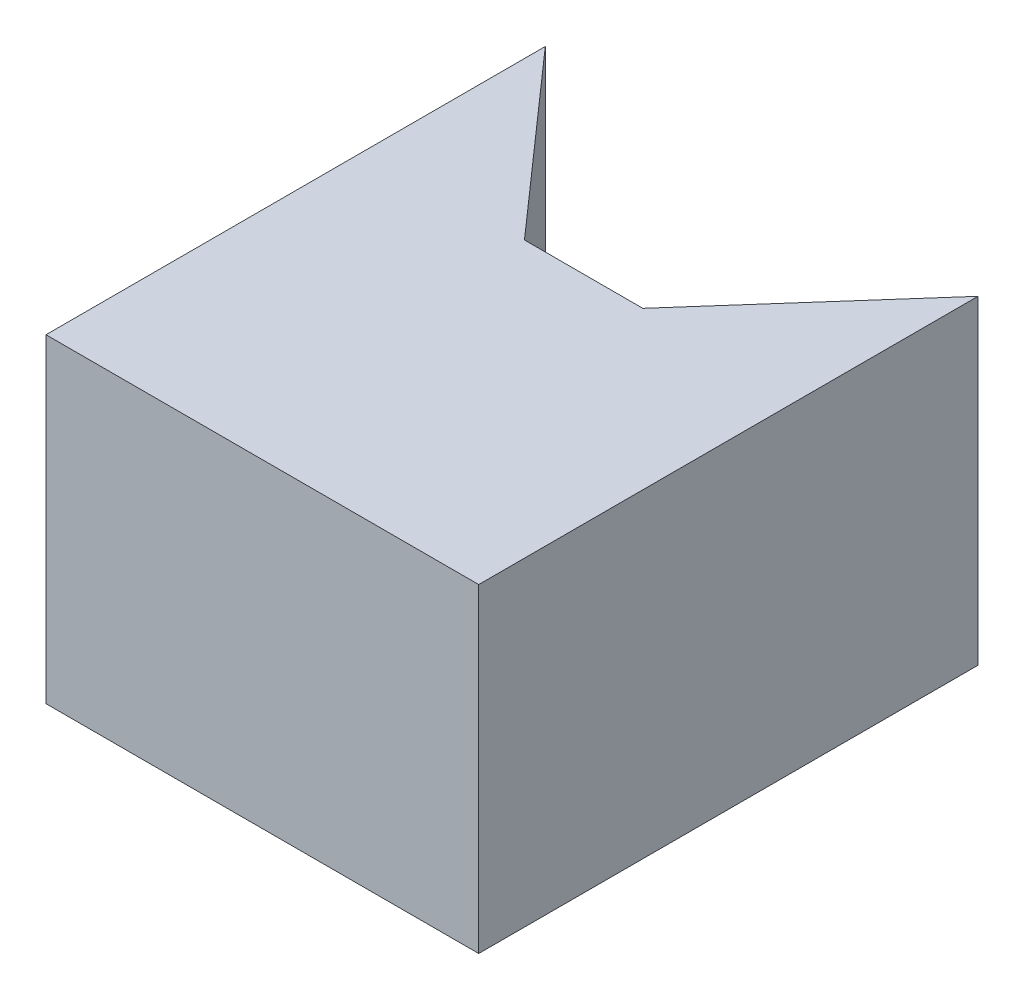
ISO-10303-21;
HEADER;
FILE_DESCRIPTION(('STEP AP214'),'2;1');
FILE_NAME('part.step','',(''),(''),'','','');
FILE_SCHEMA(('AUTOMOTIVE_DESIGN { 1 0 10303 214 1 1 1 1 }'));
ENDSEC;
DATA;
#1=APPLICATION_CONTEXT('core data for automotive mechanical design processes');
#2=APPLICATION_PROTOCOL_DEFINITION('international standard','automotive_design',2000,#1);
#3=PRODUCT_CONTEXT('',#1,'mechanical');
#4=PRODUCT('Part','Part','',(#3));
#5=PRODUCT_RELATED_PRODUCT_CATEGORY('part','',(#4));
#6=PRODUCT_DEFINITION_FORMATION('','',#4);
#7=PRODUCT_DEFINITION_CONTEXT('part definition',#1,'design');
#8=PRODUCT_DEFINITION('design','',#6,#7);
#9=PRODUCT_DEFINITION_SHAPE('','',#8);
#10=(LENGTH_UNIT() NAMED_UNIT(*) SI_UNIT(.MILLI.,.METRE.));
#11=(NAMED_UNIT(*) PLANE_ANGLE_UNIT() SI_UNIT($,.RADIAN.));
#12=(NAMED_UNIT(*) SI_UNIT($,.STERADIAN.) SOLID_ANGLE_UNIT());
#13=UNCERTAINTY_MEASURE_WITH_UNIT(LENGTH_MEASURE(1.E-05),#10,'distance_accuracy_value','');
#14=(GEOMETRIC_REPRESENTATION_CONTEXT(3) GLOBAL_UNCERTAINTY_ASSIGNED_CONTEXT((#13)) GLOBAL_UNIT_ASSIGNED_CONTEXT((#10,
#11,#12)) REPRESENTATION_CONTEXT('',''));
#15=CARTESIAN_POINT('',(0.,0.,0.));
#16=DIRECTION('',(0.,0.,1.));
#17=DIRECTION('',(1.,0.,0.));
#18=AXIS2_PLACEMENT_3D('',#15,#16,#17);
#19=CARTESIAN_POINT('',(-32.5,48.,-26.74));
#20=DIRECTION('',(-0.749616926714311,0.,0.661871938658372));
#21=DIRECTION('',(0.661871938658372,0.,0.749616926714311));
#22=AXIS2_PLACEMENT_3D('',#19,#20,#21);
#23=PLANE('',#22);
#24=DIRECTION('',(-0.661871938658372,0.,-0.749616926714311));
#25=VECTOR('',#24,1.);
#26=CARTESIAN_POINT('',(-32.5,0.,-26.74));
#27=LINE('',#26,#25);
#28=CARTESIAN_POINT('',(-8.89,0.,0.));
#29=VERTEX_POINT('',#28);
#30=CARTESIAN_POINT('',(-32.5,0.,-26.74));
#31=VERTEX_POINT('',#30);
#32=EDGE_CURVE('E117',#29,#31,#27,.T.);
#33=ORIENTED_EDGE('',*,*,#32,.T.);
#34=DIRECTION('',(0.,-1.,0.));
#35=VECTOR('',#34,1.);
#36=CARTESIAN_POINT('',(-32.5,48.,-26.74));
#37=LINE('',#36,#35);
#38=CARTESIAN_POINT('',(-32.5,48.,-26.74));
#39=VERTEX_POINT('',#38);
#40=EDGE_CURVE('E11',#39,#31,#37,.T.);
#41=ORIENTED_EDGE('',*,*,#40,.F.);
#42=DIRECTION('',(-0.661871938658372,0.,-0.749616926714311));
#43=VECTOR('',#42,1.);
#44=CARTESIAN_POINT('',(-32.5,48.,-26.74));
#45=LINE('',#44,#43);
#46=CARTESIAN_POINT('',(-8.89,48.,0.));
#47=VERTEX_POINT('',#46);
#48=EDGE_CURVE('E127',#47,#39,#45,.T.);
#49=ORIENTED_EDGE('',*,*,#48,.F.);
#50=DIRECTION('',(0.,-1.,0.));
#51=VECTOR('',#50,1.);
#52=CARTESIAN_POINT('',(-8.89,48.,0.));
#53=LINE('',#52,#51);
#54=EDGE_CURVE('E113',#47,#29,#53,.T.);
#55=ORIENTED_EDGE('',*,*,#54,.T.);
#56=EDGE_LOOP('',(#33,#41,#49,#55));
#57=FACE_BOUND('',#56,.T.);
#58=ADVANCED_FACE('F33',(#57),#23,.F.);
#59=CARTESIAN_POINT('',(-32.5,48.,48.26));
#60=DIRECTION('',(1.,0.,0.));
#61=DIRECTION('',(0.,0.,-1.));
#62=AXIS2_PLACEMENT_3D('',#59,#60,#61);
#63=PLANE('',#62);
#64=DIRECTION('',(0.,0.,1.));
#65=VECTOR('',#64,1.);
#66=CARTESIAN_POINT('',(-32.5,0.,48.26));
#67=LINE('',#66,#65);
#68=CARTESIAN_POINT('',(-32.5,0.,48.26));
#69=VERTEX_POINT('',#68);
#70=EDGE_CURVE('E120',#31,#69,#67,.T.);
#71=ORIENTED_EDGE('',*,*,#70,.T.);
#72=DIRECTION('',(0.,-1.,0.));
#73=VECTOR('',#72,1.);
#74=CARTESIAN_POINT('',(-32.5,48.,48.26));
#75=LINE('',#74,#73);
#76=CARTESIAN_POINT('',(-32.5,48.,48.26));
#77=VERTEX_POINT('',#76);
#78=EDGE_CURVE('E41',#77,#69,#75,.T.);
#79=ORIENTED_EDGE('',*,*,#78,.F.);
#80=DIRECTION('',(0.,0.,1.));
#81=VECTOR('',#80,1.);
#82=CARTESIAN_POINT('',(-32.5,48.,48.26));
#83=LINE('',#82,#81);
#84=EDGE_CURVE('E86',#39,#77,#83,.T.);
#85=ORIENTED_EDGE('',*,*,#84,.F.);
#86=ORIENTED_EDGE('',*,*,#40,.T.);
#87=EDGE_LOOP('',(#71,#79,#85,#86));
#88=FACE_BOUND('',#87,.T.);
#89=ADVANCED_FACE('F151',(#88),#63,.F.);
#90=CARTESIAN_POINT('',(32.5,48.,48.26));
#91=DIRECTION('',(0.,0.,-1.));
#92=DIRECTION('',(-1.,0.,0.));
#93=AXIS2_PLACEMENT_3D('',#90,#91,#92);
#94=PLANE('',#93);
#95=DIRECTION('',(1.,0.,0.));
#96=VECTOR('',#95,1.);
#97=CARTESIAN_POINT('',(32.5,0.,48.26));
#98=LINE('',#97,#96);
#99=CARTESIAN_POINT('',(32.5,0.,48.26));
#100=VERTEX_POINT('',#99);
#101=EDGE_CURVE('E122',#69,#100,#98,.T.);
#102=ORIENTED_EDGE('',*,*,#101,.T.);
#103=DIRECTION('',(0.,-1.,0.));
#104=VECTOR('',#103,1.);
#105=CARTESIAN_POINT('',(32.5,48.,48.26));
#106=LINE('',#105,#104);
#107=CARTESIAN_POINT('',(32.5,48.,48.26));
#108=VERTEX_POINT('',#107);
#109=EDGE_CURVE('E108',#108,#100,#106,.T.);
#110=ORIENTED_EDGE('',*,*,#109,.F.);
#111=DIRECTION('',(1.,0.,0.));
#112=VECTOR('',#111,1.);
#113=CARTESIAN_POINT('',(32.5,48.,48.26));
#114=LINE('',#113,#112);
#115=EDGE_CURVE('E99',#77,#108,#114,.T.);
#116=ORIENTED_EDGE('',*,*,#115,.F.);
#117=ORIENTED_EDGE('',*,*,#78,.T.);
#118=EDGE_LOOP('',(#102,#110,#116,#117));
#119=FACE_BOUND('',#118,.T.);
#120=ADVANCED_FACE('F133',(#119),#94,.F.);
#121=CARTESIAN_POINT('',(32.5,48.,48.26));
#122=DIRECTION('',(-1.,0.,0.));
#123=DIRECTION('',(0.,0.,1.));
#124=AXIS2_PLACEMENT_3D('',#121,#122,#123);
#125=PLANE('',#124);
#126=DIRECTION('',(0.,0.,-1.));
#127=VECTOR('',#126,1.);
#128=CARTESIAN_POINT('',(32.5,0.,48.26));
#129=LINE('',#128,#127);
#130=CARTESIAN_POINT('',(32.5,0.,-26.74));
#131=VERTEX_POINT('',#130);
#132=EDGE_CURVE('E107',#100,#131,#129,.T.);
#133=ORIENTED_EDGE('',*,*,#132,.T.);
#134=DIRECTION('',(0.,-1.,0.));
#135=VECTOR('',#134,1.);
#136=CARTESIAN_POINT('',(32.5,48.,-26.74));
#137=LINE('',#136,#135);
#138=CARTESIAN_POINT('',(32.5,48.,-26.74));
#139=VERTEX_POINT('',#138);
#140=EDGE_CURVE('E104',#139,#131,#137,.T.);
#141=ORIENTED_EDGE('',*,*,#140,.F.);
#142=DIRECTION('',(0.,0.,-1.));
#143=VECTOR('',#142,1.);
#144=CARTESIAN_POINT('',(32.5,48.,48.26));
#145=LINE('',#144,#143);
#146=EDGE_CURVE('E93',#108,#139,#145,.T.);
#147=ORIENTED_EDGE('',*,*,#146,.F.);
#148=ORIENTED_EDGE('',*,*,#109,.T.);
#149=EDGE_LOOP('',(#133,#141,#147,#148));
#150=FACE_BOUND('',#149,.T.);
#151=ADVANCED_FACE('F105',(#150),#125,.F.);
#152=CARTESIAN_POINT('',(32.5,48.,-26.74));
#153=DIRECTION('',(0.749616926714311,0.,0.661871938658372));
#154=DIRECTION('',(0.661871938658372,0.,-0.749616926714311));
#155=AXIS2_PLACEMENT_3D('',#152,#153,#154);
#156=PLANE('',#155);
#157=DIRECTION('',(-0.661871938658372,0.,0.749616926714311));
#158=VECTOR('',#157,1.);
#159=CARTESIAN_POINT('',(32.5,0.,-26.74));
#160=LINE('',#159,#158);
#161=CARTESIAN_POINT('',(8.89,0.,0.));
#162=VERTEX_POINT('',#161);
#163=EDGE_CURVE('E72',#131,#162,#160,.T.);
#164=ORIENTED_EDGE('',*,*,#163,.T.);
#165=DIRECTION('',(0.,-1.,0.));
#166=VECTOR('',#165,1.);
#167=CARTESIAN_POINT('',(8.89,48.,0.));
#168=LINE('',#167,#166);
#169=CARTESIAN_POINT('',(8.89,48.,0.));
#170=VERTEX_POINT('',#169);
#171=EDGE_CURVE('E109',#170,#162,#168,.T.);
#172=ORIENTED_EDGE('',*,*,#171,.F.);
#173=DIRECTION('',(-0.661871938658372,0.,0.749616926714311));
#174=VECTOR('',#173,1.);
#175=CARTESIAN_POINT('',(32.5,48.,-26.74));
#176=LINE('',#175,#174);
#177=EDGE_CURVE('E97',#139,#170,#176,.T.);
#178=ORIENTED_EDGE('',*,*,#177,.F.);
#179=ORIENTED_EDGE('',*,*,#140,.T.);
#180=EDGE_LOOP('',(#164,#172,#178,#179));
#181=FACE_BOUND('',#180,.T.);
#182=ADVANCED_FACE('F111',(#181),#156,.F.);
#183=CARTESIAN_POINT('',(8.89,48.,0.));
#184=DIRECTION('',(0.,0.,1.));
#185=DIRECTION('',(1.,0.,0.));
#186=AXIS2_PLACEMENT_3D('',#183,#184,#185);
#187=PLANE('',#186);
#188=DIRECTION('',(-1.,0.,0.));
#189=VECTOR('',#188,1.);
#190=CARTESIAN_POINT('',(8.89,0.,0.));
#191=LINE('',#190,#189);
#192=EDGE_CURVE('E78',#162,#29,#191,.T.);
#193=ORIENTED_EDGE('',*,*,#192,.T.);
#194=ORIENTED_EDGE('',*,*,#54,.F.);
#195=DIRECTION('',(-1.,0.,0.));
#196=VECTOR('',#195,1.);
#197=CARTESIAN_POINT('',(8.89,48.,0.));
#198=LINE('',#197,#196);
#199=EDGE_CURVE('E49',#170,#47,#198,.T.);
#200=ORIENTED_EDGE('',*,*,#199,.F.);
#201=ORIENTED_EDGE('',*,*,#171,.T.);
#202=EDGE_LOOP('',(#193,#194,#200,#201));
#203=FACE_BOUND('',#202,.T.);
#204=ADVANCED_FACE('F140',(#203),#187,.F.);
#205=CARTESIAN_POINT('',(0.,48.,0.));
#206=DIRECTION('',(0.,-1.,0.));
#207=DIRECTION('',(0.,0.,-1.));
#208=AXIS2_PLACEMENT_3D('',#205,#206,#207);
#209=PLANE('',#208);
#210=ORIENTED_EDGE('',*,*,#48,.T.);
#211=ORIENTED_EDGE('',*,*,#84,.T.);
#212=ORIENTED_EDGE('',*,*,#115,.T.);
#213=ORIENTED_EDGE('',*,*,#146,.T.);
#214=ORIENTED_EDGE('',*,*,#177,.T.);
#215=ORIENTED_EDGE('',*,*,#199,.T.);
#216=EDGE_LOOP('',(#210,#211,#212,#213,#214,#215));
#217=FACE_BOUND('',#216,.T.);
#218=ADVANCED_FACE('F95',(#217),#209,.F.);
#219=CARTESIAN_POINT('',(0.,0.,0.));
#220=DIRECTION('',(0.,-1.,0.));
#221=DIRECTION('',(0.,0.,-1.));
#222=AXIS2_PLACEMENT_3D('',#219,#220,#221);
#223=PLANE('',#222);
#224=ORIENTED_EDGE('',*,*,#32,.F.);
#225=ORIENTED_EDGE('',*,*,#192,.F.);
#226=ORIENTED_EDGE('',*,*,#163,.F.);
#227=ORIENTED_EDGE('',*,*,#132,.F.);
#228=ORIENTED_EDGE('',*,*,#101,.F.);
#229=ORIENTED_EDGE('',*,*,#70,.F.);
#230=EDGE_LOOP('',(#224,#225,#226,#227,#228,#229));
#231=FACE_BOUND('',#230,.T.);
#232=ADVANCED_FACE('F136',(#231),#223,.T.);
#233=CLOSED_SHELL('',(#58,#89,#120,#151,#182,#204,#218,#232));
#234=MANIFOLD_SOLID_BREP('B2',#233);
#235=ADVANCED_BREP_SHAPE_REPRESENTATION('',(#18,#234),#14);
#236=SHAPE_DEFINITION_REPRESENTATION(#9,#235);
ENDSEC;
END-ISO-10303-21;
